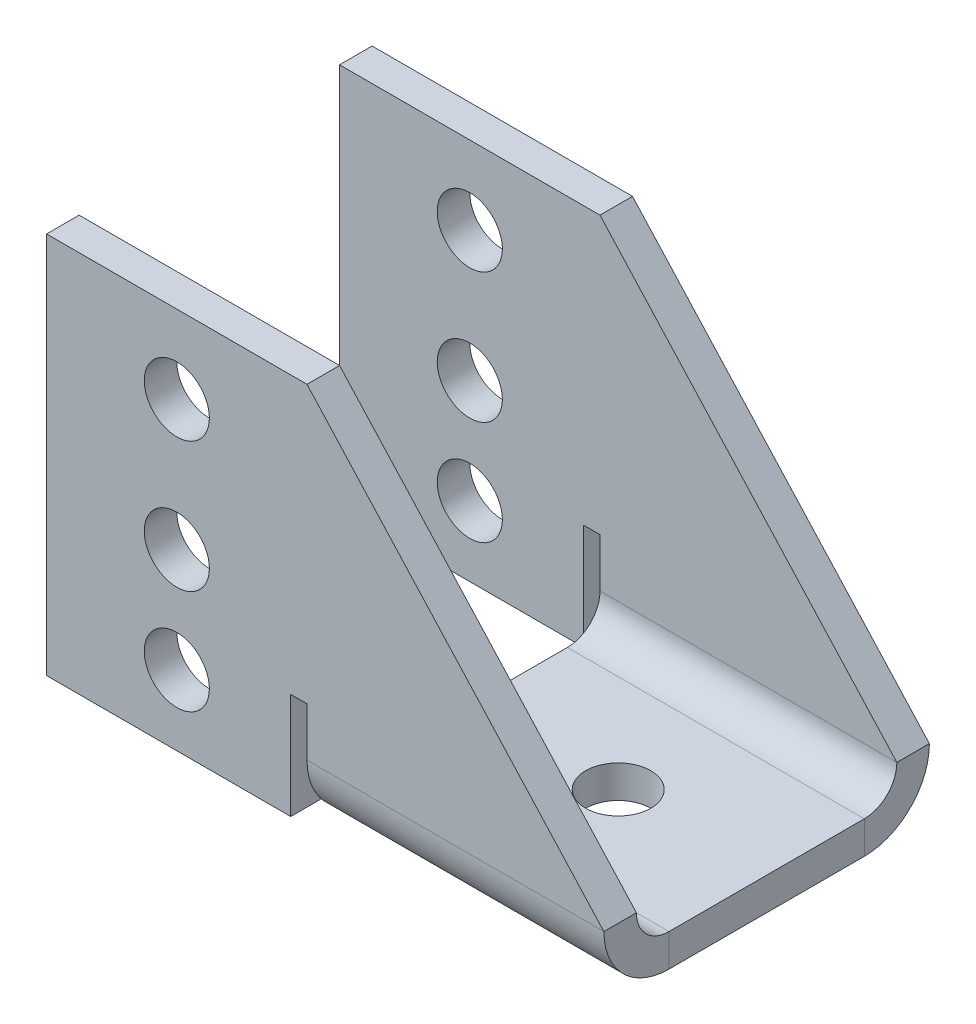
ISO-10303-21;
HEADER;
FILE_DESCRIPTION(('STEP AP214'),'2;1');
FILE_NAME('part.step','',(''),(''),'','','');
FILE_SCHEMA(('AUTOMOTIVE_DESIGN { 1 0 10303 214 1 1 1 1 }'));
ENDSEC;
DATA;
#1=APPLICATION_CONTEXT('core data for automotive mechanical design processes');
#2=APPLICATION_PROTOCOL_DEFINITION('international standard','automotive_design',2000,#1);
#3=PRODUCT_CONTEXT('',#1,'mechanical');
#4=PRODUCT('Part','Part','',(#3));
#5=PRODUCT_RELATED_PRODUCT_CATEGORY('part','',(#4));
#6=PRODUCT_DEFINITION_FORMATION('','',#4);
#7=PRODUCT_DEFINITION_CONTEXT('part definition',#1,'design');
#8=PRODUCT_DEFINITION('design','',#6,#7);
#9=PRODUCT_DEFINITION_SHAPE('','',#8);
#10=(LENGTH_UNIT() NAMED_UNIT(*) SI_UNIT(.MILLI.,.METRE.));
#11=(NAMED_UNIT(*) PLANE_ANGLE_UNIT() SI_UNIT($,.RADIAN.));
#12=(NAMED_UNIT(*) SI_UNIT($,.STERADIAN.) SOLID_ANGLE_UNIT());
#13=UNCERTAINTY_MEASURE_WITH_UNIT(LENGTH_MEASURE(1.E-05),#10,'distance_accuracy_value','');
#14=(GEOMETRIC_REPRESENTATION_CONTEXT(3) GLOBAL_UNCERTAINTY_ASSIGNED_CONTEXT((#13)) GLOBAL_UNIT_ASSIGNED_CONTEXT((#10,
#11,#12)) REPRESENTATION_CONTEXT('',''));
#15=CARTESIAN_POINT('',(0.,0.,0.));
#16=DIRECTION('',(0.,0.,1.));
#17=DIRECTION('',(1.,0.,0.));
#18=AXIS2_PLACEMENT_3D('',#15,#16,#17);
#19=CARTESIAN_POINT('',(54.356,3.175,-25.4));
#20=DIRECTION('',(1.,0.,0.));
#21=DIRECTION('',(0.,0.,1.));
#22=AXIS2_PLACEMENT_3D('',#19,#20,#21);
#23=PLANE('',#22);
#24=DIRECTION('',(0.,1.,0.));
#25=VECTOR('',#24,1.);
#26=CARTESIAN_POINT('',(54.356,3.175,-3.175));
#27=LINE('',#26,#25);
#28=CARTESIAN_POINT('',(54.356,0.,-3.175));
#29=VERTEX_POINT('',#28);
#30=CARTESIAN_POINT('',(54.356,3.175,-3.175));
#31=VERTEX_POINT('',#30);
#32=EDGE_CURVE('E11',#29,#31,#27,.T.);
#33=ORIENTED_EDGE('',*,*,#32,.F.);
#34=DIRECTION('',(0.,0.,1.));
#35=VECTOR('',#34,1.);
#36=CARTESIAN_POINT('',(54.356,0.,-25.4));
#37=LINE('',#36,#35);
#38=CARTESIAN_POINT('',(54.356,0.,-22.225));
#39=VERTEX_POINT('',#38);
#40=EDGE_CURVE('E124',#39,#29,#37,.T.);
#41=ORIENTED_EDGE('',*,*,#40,.F.);
#42=DIRECTION('',(0.,1.,0.));
#43=VECTOR('',#42,1.);
#44=CARTESIAN_POINT('',(54.356,3.175,-22.225));
#45=LINE('',#44,#43);
#46=CARTESIAN_POINT('',(54.356,3.175,-22.225));
#47=VERTEX_POINT('',#46);
#48=EDGE_CURVE('E53',#39,#47,#45,.T.);
#49=ORIENTED_EDGE('',*,*,#48,.T.);
#50=DIRECTION('',(0.,0.,1.));
#51=VECTOR('',#50,1.);
#52=CARTESIAN_POINT('',(54.356,3.175,-25.4));
#53=LINE('',#52,#51);
#54=EDGE_CURVE('E126',#47,#31,#53,.T.);
#55=ORIENTED_EDGE('',*,*,#54,.T.);
#56=EDGE_LOOP('',(#33,#41,#49,#55));
#57=FACE_BOUND('',#56,.T.);
#58=ADVANCED_FACE('F43',(#57),#23,.T.);
#59=CARTESIAN_POINT('',(54.356,6.35,-22.225));
#60=DIRECTION('',(-1.,0.,0.));
#61=DIRECTION('',(0.,0.,1.));
#62=AXIS2_PLACEMENT_3D('',#59,#60,#61);
#63=PLANE('',#62);
#64=ORIENTED_EDGE('',*,*,#48,.F.);
#65=CARTESIAN_POINT('',(54.356,6.35,-22.225));
#66=DIRECTION('',(-1.,0.,0.));
#67=DIRECTION('',(0.,-1.,0.));
#68=AXIS2_PLACEMENT_3D('',#65,#66,#67);
#69=CIRCLE('',#68,6.35);
#70=CARTESIAN_POINT('',(54.356,6.34999999999999,-28.575));
#71=VERTEX_POINT('',#70);
#72=EDGE_CURVE('E166',#39,#71,#69,.F.);
#73=ORIENTED_EDGE('',*,*,#72,.T.);
#74=DIRECTION('',(0.,0.,1.));
#75=VECTOR('',#74,1.);
#76=CARTESIAN_POINT('',(54.356,6.34999999999999,-25.4));
#77=LINE('',#76,#75);
#78=CARTESIAN_POINT('',(54.356,6.34999999999999,-25.4));
#79=VERTEX_POINT('',#78);
#80=EDGE_CURVE('E239',#71,#79,#77,.T.);
#81=ORIENTED_EDGE('',*,*,#80,.T.);
#82=CARTESIAN_POINT('',(54.356,6.35,-22.225));
#83=DIRECTION('',(1.,0.,0.));
#84=DIRECTION('',(0.,0.,-1.));
#85=AXIS2_PLACEMENT_3D('',#82,#83,#84);
#86=CIRCLE('',#85,3.175);
#87=EDGE_CURVE('E247',#47,#79,#86,.T.);
#88=ORIENTED_EDGE('',*,*,#87,.F.);
#89=EDGE_LOOP('',(#64,#73,#81,#88));
#90=FACE_BOUND('',#89,.T.);
#91=ADVANCED_FACE('F246',(#90),#63,.F.);
#92=CARTESIAN_POINT('',(32.8360294888369,29.9464588938192,-25.4));
#93=DIRECTION('',(0.738869281565121,0.67384878478739,0.));
#94=DIRECTION('',(0.67384878478739,-0.738869281565121,0.));
#95=AXIS2_PLACEMENT_3D('',#92,#93,#94);
#96=PLANE('',#95);
#97=ORIENTED_EDGE('',*,*,#80,.F.);
#98=DIRECTION('',(0.67384878478739,-0.738869281565121,0.));
#99=VECTOR('',#98,1.);
#100=CARTESIAN_POINT('',(32.8360294888369,29.9464588938192,-28.575));
#101=LINE('',#100,#99);
#102=CARTESIAN_POINT('',(25.4,38.1,-28.575));
#103=VERTEX_POINT('',#102);
#104=EDGE_CURVE('E326',#103,#71,#101,.T.);
#105=ORIENTED_EDGE('',*,*,#104,.F.);
#106=DIRECTION('',(0.,0.,1.));
#107=VECTOR('',#106,1.);
#108=CARTESIAN_POINT('',(25.4,38.1,-25.4));
#109=LINE('',#108,#107);
#110=CARTESIAN_POINT('',(25.4,38.1,-25.4));
#111=VERTEX_POINT('',#110);
#112=EDGE_CURVE('E236',#103,#111,#109,.T.);
#113=ORIENTED_EDGE('',*,*,#112,.T.);
#114=DIRECTION('',(0.67384878478739,-0.738869281565121,0.));
#115=VECTOR('',#114,1.);
#116=CARTESIAN_POINT('',(32.8360294888369,29.9464588938192,-25.4));
#117=LINE('',#116,#115);
#118=EDGE_CURVE('E266',#111,#79,#117,.T.);
#119=ORIENTED_EDGE('',*,*,#118,.T.);
#120=EDGE_LOOP('',(#97,#105,#113,#119));
#121=FACE_BOUND('',#120,.T.);
#122=ADVANCED_FACE('F267',(#121),#96,.T.);
#123=CARTESIAN_POINT('',(0.,38.1,-25.4));
#124=DIRECTION('',(0.,1.,0.));
#125=DIRECTION('',(1.,0.,0.));
#126=AXIS2_PLACEMENT_3D('',#123,#124,#125);
#127=PLANE('',#126);
#128=ORIENTED_EDGE('',*,*,#112,.F.);
#129=DIRECTION('',(1.,0.,0.));
#130=VECTOR('',#129,1.);
#131=CARTESIAN_POINT('',(0.,38.1,-28.575));
#132=LINE('',#131,#130);
#133=CARTESIAN_POINT('',(0.,38.1,-28.575));
#134=VERTEX_POINT('',#133);
#135=EDGE_CURVE('E329',#134,#103,#132,.T.);
#136=ORIENTED_EDGE('',*,*,#135,.F.);
#137=DIRECTION('',(0.,0.,1.));
#138=VECTOR('',#137,1.);
#139=CARTESIAN_POINT('',(0.,38.1,-25.4));
#140=LINE('',#139,#138);
#141=CARTESIAN_POINT('',(0.,38.1,-25.4));
#142=VERTEX_POINT('',#141);
#143=EDGE_CURVE('E233',#134,#142,#140,.T.);
#144=ORIENTED_EDGE('',*,*,#143,.T.);
#145=DIRECTION('',(1.,0.,0.));
#146=VECTOR('',#145,1.);
#147=CARTESIAN_POINT('',(0.,38.1,-25.4));
#148=LINE('',#147,#146);
#149=EDGE_CURVE('E271',#142,#111,#148,.T.);
#150=ORIENTED_EDGE('',*,*,#149,.T.);
#151=EDGE_LOOP('',(#128,#136,#144,#150));
#152=FACE_BOUND('',#151,.T.);
#153=ADVANCED_FACE('F341',(#152),#127,.T.);
#154=CARTESIAN_POINT('',(0.,0.,-25.4));
#155=DIRECTION('',(-1.,0.,0.));
#156=DIRECTION('',(0.,1.,0.));
#157=AXIS2_PLACEMENT_3D('',#154,#155,#156);
#158=PLANE('',#157);
#159=ORIENTED_EDGE('',*,*,#143,.F.);
#160=DIRECTION('',(0.,-1.,0.));
#161=VECTOR('',#160,1.);
#162=CARTESIAN_POINT('',(0.,0.,-28.575));
#163=LINE('',#162,#161);
#164=CARTESIAN_POINT('',(0.,0.79375,-28.575));
#165=VERTEX_POINT('',#164);
#166=EDGE_CURVE('E182',#165,#134,#163,.F.);
#167=ORIENTED_EDGE('',*,*,#166,.F.);
#168=DIRECTION('',(0.,0.,1.));
#169=VECTOR('',#168,1.);
#170=CARTESIAN_POINT('',(0.,0.79375,-25.4));
#171=LINE('',#170,#169);
#172=CARTESIAN_POINT('',(0.,0.79375,-25.4));
#173=VERTEX_POINT('',#172);
#174=EDGE_CURVE('E230',#165,#173,#171,.T.);
#175=ORIENTED_EDGE('',*,*,#174,.T.);
#176=DIRECTION('',(0.,1.,0.));
#177=VECTOR('',#176,1.);
#178=CARTESIAN_POINT('',(0.,0.,-25.4));
#179=LINE('',#178,#177);
#180=EDGE_CURVE('E346',#173,#142,#179,.T.);
#181=ORIENTED_EDGE('',*,*,#180,.T.);
#182=EDGE_LOOP('',(#159,#167,#175,#181));
#183=FACE_BOUND('',#182,.T.);
#184=ADVANCED_FACE('F769',(#183),#158,.T.);
#185=CARTESIAN_POINT('',(0.,0.79375,-25.4));
#186=DIRECTION('',(0.,-1.,0.));
#187=DIRECTION('',(-1.,0.,0.));
#188=AXIS2_PLACEMENT_3D('',#185,#186,#187);
#189=PLANE('',#188);
#190=ORIENTED_EDGE('',*,*,#174,.F.);
#191=DIRECTION('',(1.,0.,0.));
#192=VECTOR('',#191,1.);
#193=CARTESIAN_POINT('',(0.,0.79375,-28.575));
#194=LINE('',#193,#192);
#195=CARTESIAN_POINT('',(23.8125,0.79375,-28.575));
#196=VERTEX_POINT('',#195);
#197=EDGE_CURVE('E191',#196,#165,#194,.F.);
#198=ORIENTED_EDGE('',*,*,#197,.F.);
#199=DIRECTION('',(0.,0.,1.));
#200=VECTOR('',#199,1.);
#201=CARTESIAN_POINT('',(23.8125,0.79375,-25.4));
#202=LINE('',#201,#200);
#203=CARTESIAN_POINT('',(23.8125,0.79375,-25.4));
#204=VERTEX_POINT('',#203);
#205=EDGE_CURVE('E227',#196,#204,#202,.T.);
#206=ORIENTED_EDGE('',*,*,#205,.T.);
#207=DIRECTION('',(-1.,0.,0.));
#208=VECTOR('',#207,1.);
#209=CARTESIAN_POINT('',(0.,0.79375,-25.4));
#210=LINE('',#209,#208);
#211=EDGE_CURVE('E272',#204,#173,#210,.T.);
#212=ORIENTED_EDGE('',*,*,#211,.T.);
#213=EDGE_LOOP('',(#190,#198,#206,#212));
#214=FACE_BOUND('',#213,.T.);
#215=ADVANCED_FACE('F416',(#214),#189,.T.);
#216=CARTESIAN_POINT('',(23.8125,0.,-25.4));
#217=DIRECTION('',(-1.,0.,0.));
#218=DIRECTION('',(0.,1.,0.));
#219=AXIS2_PLACEMENT_3D('',#216,#217,#218);
#220=PLANE('',#219);
#221=ORIENTED_EDGE('',*,*,#205,.F.);
#222=DIRECTION('',(0.,-1.,0.));
#223=VECTOR('',#222,1.);
#224=CARTESIAN_POINT('',(23.8125,0.,-28.575));
#225=LINE('',#224,#223);
#226=CARTESIAN_POINT('',(23.8125,11.1125,-28.575));
#227=VERTEX_POINT('',#226);
#228=EDGE_CURVE('E298',#196,#227,#225,.F.);
#229=ORIENTED_EDGE('',*,*,#228,.T.);
#230=DIRECTION('',(0.,0.,1.));
#231=VECTOR('',#230,1.);
#232=CARTESIAN_POINT('',(23.8125,11.1125,-25.4));
#233=LINE('',#232,#231);
#234=CARTESIAN_POINT('',(23.8125,11.1125,-25.4));
#235=VERTEX_POINT('',#234);
#236=EDGE_CURVE('E224',#227,#235,#233,.T.);
#237=ORIENTED_EDGE('',*,*,#236,.T.);
#238=DIRECTION('',(0.,1.,0.));
#239=VECTOR('',#238,1.);
#240=CARTESIAN_POINT('',(23.8125,0.,-25.4));
#241=LINE('',#240,#239);
#242=EDGE_CURVE('E379',#204,#235,#241,.T.);
#243=ORIENTED_EDGE('',*,*,#242,.F.);
#244=EDGE_LOOP('',(#221,#229,#237,#243));
#245=FACE_BOUND('',#244,.T.);
#246=ADVANCED_FACE('F427',(#245),#220,.F.);
#247=CARTESIAN_POINT('',(0.,11.1125,-25.4));
#248=DIRECTION('',(0.,1.,0.));
#249=DIRECTION('',(1.,0.,0.));
#250=AXIS2_PLACEMENT_3D('',#247,#248,#249);
#251=PLANE('',#250);
#252=ORIENTED_EDGE('',*,*,#236,.F.);
#253=DIRECTION('',(1.,0.,0.));
#254=VECTOR('',#253,1.);
#255=CARTESIAN_POINT('',(0.,11.1125,-28.575));
#256=LINE('',#255,#254);
#257=CARTESIAN_POINT('',(25.4,11.1125,-28.575));
#258=VERTEX_POINT('',#257);
#259=EDGE_CURVE('E319',#227,#258,#256,.T.);
#260=ORIENTED_EDGE('',*,*,#259,.T.);
#261=DIRECTION('',(0.,0.,1.));
#262=VECTOR('',#261,1.);
#263=CARTESIAN_POINT('',(25.4,11.1125,-25.4));
#264=LINE('',#263,#262);
#265=CARTESIAN_POINT('',(25.4,11.1125,-25.4));
#266=VERTEX_POINT('',#265);
#267=EDGE_CURVE('E221',#258,#266,#264,.T.);
#268=ORIENTED_EDGE('',*,*,#267,.T.);
#269=DIRECTION('',(1.,0.,0.));
#270=VECTOR('',#269,1.);
#271=CARTESIAN_POINT('',(0.,11.1125,-25.4));
#272=LINE('',#271,#270);
#273=EDGE_CURVE('E382',#235,#266,#272,.T.);
#274=ORIENTED_EDGE('',*,*,#273,.F.);
#275=EDGE_LOOP('',(#252,#260,#268,#274));
#276=FACE_BOUND('',#275,.T.);
#277=ADVANCED_FACE('F433',(#276),#251,.F.);
#278=CARTESIAN_POINT('',(25.4,0.,-25.4));
#279=DIRECTION('',(1.,0.,0.));
#280=DIRECTION('',(0.,-1.,0.));
#281=AXIS2_PLACEMENT_3D('',#278,#279,#280);
#282=PLANE('',#281);
#283=ORIENTED_EDGE('',*,*,#267,.F.);
#284=DIRECTION('',(0.,-1.,0.));
#285=VECTOR('',#284,1.);
#286=CARTESIAN_POINT('',(25.4,0.,-28.575));
#287=LINE('',#286,#285);
#288=CARTESIAN_POINT('',(25.4,6.35,-28.575));
#289=VERTEX_POINT('',#288);
#290=EDGE_CURVE('E313',#258,#289,#287,.T.);
#291=ORIENTED_EDGE('',*,*,#290,.T.);
#292=DIRECTION('',(0.,0.,1.));
#293=VECTOR('',#292,1.);
#294=CARTESIAN_POINT('',(25.4,6.35,-25.4));
#295=LINE('',#294,#293);
#296=CARTESIAN_POINT('',(25.4,6.35,-25.4));
#297=VERTEX_POINT('',#296);
#298=EDGE_CURVE('E218',#289,#297,#295,.T.);
#299=ORIENTED_EDGE('',*,*,#298,.T.);
#300=DIRECTION('',(0.,-1.,0.));
#301=VECTOR('',#300,1.);
#302=CARTESIAN_POINT('',(25.4,0.,-25.4));
#303=LINE('',#302,#301);
#304=EDGE_CURVE('E278',#266,#297,#303,.T.);
#305=ORIENTED_EDGE('',*,*,#304,.F.);
#306=EDGE_LOOP('',(#283,#291,#299,#305));
#307=FACE_BOUND('',#306,.T.);
#308=ADVANCED_FACE('F435',(#307),#282,.F.);
#309=CARTESIAN_POINT('',(25.4,6.35,-22.225));
#310=DIRECTION('',(-1.,0.,0.));
#311=DIRECTION('',(0.,-1.,0.));
#312=AXIS2_PLACEMENT_3D('',#309,#310,#311);
#313=PLANE('',#312);
#314=ORIENTED_EDGE('',*,*,#298,.F.);
#315=CARTESIAN_POINT('',(25.4,6.35,-22.225));
#316=DIRECTION('',(-1.,0.,0.));
#317=DIRECTION('',(0.,-1.,0.));
#318=AXIS2_PLACEMENT_3D('',#315,#316,#317);
#319=CIRCLE('',#318,6.35);
#320=CARTESIAN_POINT('',(25.4,0.,-22.225));
#321=VERTEX_POINT('',#320);
#322=EDGE_CURVE('E161',#289,#321,#319,.T.);
#323=ORIENTED_EDGE('',*,*,#322,.T.);
#324=DIRECTION('',(0.,1.,0.));
#325=VECTOR('',#324,1.);
#326=CARTESIAN_POINT('',(25.4,3.175,-22.225));
#327=LINE('',#326,#325);
#328=CARTESIAN_POINT('',(25.4,3.175,-22.225));
#329=VERTEX_POINT('',#328);
#330=EDGE_CURVE('E216',#321,#329,#327,.T.);
#331=ORIENTED_EDGE('',*,*,#330,.T.);
#332=CARTESIAN_POINT('',(25.4,6.35,-22.225));
#333=DIRECTION('',(1.,0.,0.));
#334=DIRECTION('',(0.,1.,0.));
#335=AXIS2_PLACEMENT_3D('',#332,#333,#334);
#336=CIRCLE('',#335,3.175);
#337=EDGE_CURVE('E263',#297,#329,#336,.F.);
#338=ORIENTED_EDGE('',*,*,#337,.F.);
#339=EDGE_LOOP('',(#314,#323,#331,#338));
#340=FACE_BOUND('',#339,.T.);
#341=ADVANCED_FACE('F811',(#340),#313,.T.);
#342=CARTESIAN_POINT('',(25.4,3.175,-25.4));
#343=DIRECTION('',(1.,0.,0.));
#344=DIRECTION('',(0.,0.,1.));
#345=AXIS2_PLACEMENT_3D('',#342,#343,#344);
#346=PLANE('',#345);
#347=ORIENTED_EDGE('',*,*,#330,.F.);
#348=DIRECTION('',(0.,0.,1.));
#349=VECTOR('',#348,1.);
#350=CARTESIAN_POINT('',(25.4,0.,-25.4));
#351=LINE('',#350,#349);
#352=CARTESIAN_POINT('',(25.4,0.,-3.175));
#353=VERTEX_POINT('',#352);
#354=EDGE_CURVE('E154',#321,#353,#351,.T.);
#355=ORIENTED_EDGE('',*,*,#354,.T.);
#356=DIRECTION('',(0.,1.,0.));
#357=VECTOR('',#356,1.);
#358=CARTESIAN_POINT('',(25.4,3.175,-3.175));
#359=LINE('',#358,#357);
#360=CARTESIAN_POINT('',(25.4,3.175,-3.175));
#361=VERTEX_POINT('',#360);
#362=EDGE_CURVE('E213',#353,#361,#359,.T.);
#363=ORIENTED_EDGE('',*,*,#362,.T.);
#364=DIRECTION('',(0.,0.,1.));
#365=VECTOR('',#364,1.);
#366=CARTESIAN_POINT('',(25.4,3.175,-25.4));
#367=LINE('',#366,#365);
#368=EDGE_CURVE('E355',#329,#361,#367,.T.);
#369=ORIENTED_EDGE('',*,*,#368,.F.);
#370=EDGE_LOOP('',(#347,#355,#363,#369));
#371=FACE_BOUND('',#370,.T.);
#372=ADVANCED_FACE('F821',(#371),#346,.F.);
#373=CARTESIAN_POINT('',(25.4,6.35,-3.175));
#374=DIRECTION('',(-1.,0.,0.));
#375=DIRECTION('',(0.,-1.,0.));
#376=AXIS2_PLACEMENT_3D('',#373,#374,#375);
#377=PLANE('',#376);
#378=ORIENTED_EDGE('',*,*,#362,.F.);
#379=CARTESIAN_POINT('',(25.4,6.35,-3.175));
#380=DIRECTION('',(-1.,0.,0.));
#381=DIRECTION('',(0.,-1.,0.));
#382=AXIS2_PLACEMENT_3D('',#379,#380,#381);
#383=CIRCLE('',#382,6.35);
#384=CARTESIAN_POINT('',(25.4,6.35,3.175));
#385=VERTEX_POINT('',#384);
#386=EDGE_CURVE('E142',#353,#385,#383,.T.);
#387=ORIENTED_EDGE('',*,*,#386,.T.);
#388=DIRECTION('',(0.,0.,-1.));
#389=VECTOR('',#388,1.);
#390=CARTESIAN_POINT('',(25.4,6.35,0.));
#391=LINE('',#390,#389);
#392=CARTESIAN_POINT('',(25.4,6.35,0.));
#393=VERTEX_POINT('',#392);
#394=EDGE_CURVE('E210',#385,#393,#391,.T.);
#395=ORIENTED_EDGE('',*,*,#394,.T.);
#396=CARTESIAN_POINT('',(25.4,6.35,-3.175));
#397=DIRECTION('',(1.,0.,0.));
#398=DIRECTION('',(0.,1.,0.));
#399=AXIS2_PLACEMENT_3D('',#396,#397,#398);
#400=CIRCLE('',#399,3.175);
#401=EDGE_CURVE('E287',#361,#393,#400,.F.);
#402=ORIENTED_EDGE('',*,*,#401,.F.);
#403=EDGE_LOOP('',(#378,#387,#395,#402));
#404=FACE_BOUND('',#403,.T.);
#405=ADVANCED_FACE('F448',(#404),#377,.T.);
#406=CARTESIAN_POINT('',(25.4,0.,0.));
#407=DIRECTION('',(1.,0.,0.));
#408=DIRECTION('',(0.,1.,0.));
#409=AXIS2_PLACEMENT_3D('',#406,#407,#408);
#410=PLANE('',#409);
#411=ORIENTED_EDGE('',*,*,#394,.F.);
#412=DIRECTION('',(0.,1.,0.));
#413=VECTOR('',#412,1.);
#414=CARTESIAN_POINT('',(25.4,0.,3.175));
#415=LINE('',#414,#413);
#416=CARTESIAN_POINT('',(25.4,11.1125,3.175));
#417=VERTEX_POINT('',#416);
#418=EDGE_CURVE('E147',#385,#417,#415,.T.);
#419=ORIENTED_EDGE('',*,*,#418,.T.);
#420=DIRECTION('',(0.,0.,-1.));
#421=VECTOR('',#420,1.);
#422=CARTESIAN_POINT('',(25.4,11.1125,0.));
#423=LINE('',#422,#421);
#424=CARTESIAN_POINT('',(25.4,11.1125,0.));
#425=VERTEX_POINT('',#424);
#426=EDGE_CURVE('E207',#417,#425,#423,.T.);
#427=ORIENTED_EDGE('',*,*,#426,.T.);
#428=DIRECTION('',(0.,1.,0.));
#429=VECTOR('',#428,1.);
#430=CARTESIAN_POINT('',(25.4,0.,0.));
#431=LINE('',#430,#429);
#432=EDGE_CURVE('E391',#393,#425,#431,.T.);
#433=ORIENTED_EDGE('',*,*,#432,.F.);
#434=EDGE_LOOP('',(#411,#419,#427,#433));
#435=FACE_BOUND('',#434,.T.);
#436=ADVANCED_FACE('F451',(#435),#410,.F.);
#437=CARTESIAN_POINT('',(0.,11.1125,0.));
#438=DIRECTION('',(0.,1.,0.));
#439=DIRECTION('',(-1.,0.,0.));
#440=AXIS2_PLACEMENT_3D('',#437,#438,#439);
#441=PLANE('',#440);
#442=ORIENTED_EDGE('',*,*,#426,.F.);
#443=DIRECTION('',(1.,0.,0.));
#444=VECTOR('',#443,1.);
#445=CARTESIAN_POINT('',(0.,11.1125,3.175));
#446=LINE('',#445,#444);
#447=CARTESIAN_POINT('',(23.8125,11.1125,3.175));
#448=VERTEX_POINT('',#447);
#449=EDGE_CURVE('E310',#417,#448,#446,.F.);
#450=ORIENTED_EDGE('',*,*,#449,.T.);
#451=DIRECTION('',(0.,0.,-1.));
#452=VECTOR('',#451,1.);
#453=CARTESIAN_POINT('',(23.8125,11.1125,0.));
#454=LINE('',#453,#452);
#455=CARTESIAN_POINT('',(23.8125,11.1125,0.));
#456=VERTEX_POINT('',#455);
#457=EDGE_CURVE('E204',#448,#456,#454,.T.);
#458=ORIENTED_EDGE('',*,*,#457,.T.);
#459=DIRECTION('',(-1.,0.,0.));
#460=VECTOR('',#459,1.);
#461=CARTESIAN_POINT('',(0.,11.1125,0.));
#462=LINE('',#461,#460);
#463=EDGE_CURVE('E385',#425,#456,#462,.T.);
#464=ORIENTED_EDGE('',*,*,#463,.F.);
#465=EDGE_LOOP('',(#442,#450,#458,#464));
#466=FACE_BOUND('',#465,.T.);
#467=ADVANCED_FACE('F460',(#466),#441,.F.);
#468=CARTESIAN_POINT('',(23.8125,0.,0.));
#469=DIRECTION('',(-1.,0.,0.));
#470=DIRECTION('',(0.,-1.,0.));
#471=AXIS2_PLACEMENT_3D('',#468,#469,#470);
#472=PLANE('',#471);
#473=ORIENTED_EDGE('',*,*,#457,.F.);
#474=DIRECTION('',(0.,1.,0.));
#475=VECTOR('',#474,1.);
#476=CARTESIAN_POINT('',(23.8125,0.,3.175));
#477=LINE('',#476,#475);
#478=CARTESIAN_POINT('',(23.8125,0.79375,3.175));
#479=VERTEX_POINT('',#478);
#480=EDGE_CURVE('E307',#448,#479,#477,.F.);
#481=ORIENTED_EDGE('',*,*,#480,.T.);
#482=DIRECTION('',(0.,0.,-1.));
#483=VECTOR('',#482,1.);
#484=CARTESIAN_POINT('',(23.8125,0.79375,0.));
#485=LINE('',#484,#483);
#486=CARTESIAN_POINT('',(23.8125,0.79375,0.));
#487=VERTEX_POINT('',#486);
#488=EDGE_CURVE('E201',#479,#487,#485,.T.);
#489=ORIENTED_EDGE('',*,*,#488,.T.);
#490=DIRECTION('',(0.,-1.,0.));
#491=VECTOR('',#490,1.);
#492=CARTESIAN_POINT('',(23.8125,0.,0.));
#493=LINE('',#492,#491);
#494=EDGE_CURVE('E388',#456,#487,#493,.T.);
#495=ORIENTED_EDGE('',*,*,#494,.F.);
#496=EDGE_LOOP('',(#473,#481,#489,#495));
#497=FACE_BOUND('',#496,.T.);
#498=ADVANCED_FACE('F488',(#497),#472,.F.);
#499=CARTESIAN_POINT('',(0.,0.79375,0.));
#500=DIRECTION('',(0.,-1.,0.));
#501=DIRECTION('',(1.,0.,0.));
#502=AXIS2_PLACEMENT_3D('',#499,#500,#501);
#503=PLANE('',#502);
#504=ORIENTED_EDGE('',*,*,#488,.F.);
#505=DIRECTION('',(1.,0.,0.));
#506=VECTOR('',#505,1.);
#507=CARTESIAN_POINT('',(0.,0.79375,3.175));
#508=LINE('',#507,#506);
#509=CARTESIAN_POINT('',(0.,0.79375,3.175));
#510=VERTEX_POINT('',#509);
#511=EDGE_CURVE('E179',#510,#479,#508,.T.);
#512=ORIENTED_EDGE('',*,*,#511,.F.);
#513=DIRECTION('',(0.,0.,-1.));
#514=VECTOR('',#513,1.);
#515=CARTESIAN_POINT('',(0.,0.79375,0.));
#516=LINE('',#515,#514);
#517=CARTESIAN_POINT('',(0.,0.79375,0.));
#518=VERTEX_POINT('',#517);
#519=EDGE_CURVE('E198',#510,#518,#516,.T.);
#520=ORIENTED_EDGE('',*,*,#519,.T.);
#521=DIRECTION('',(1.,0.,0.));
#522=VECTOR('',#521,1.);
#523=CARTESIAN_POINT('',(0.,0.79375,0.));
#524=LINE('',#523,#522);
#525=EDGE_CURVE('E367',#518,#487,#524,.T.);
#526=ORIENTED_EDGE('',*,*,#525,.T.);
#527=EDGE_LOOP('',(#504,#512,#520,#526));
#528=FACE_BOUND('',#527,.T.);
#529=ADVANCED_FACE('F479',(#528),#503,.T.);
#530=CARTESIAN_POINT('',(0.,0.,0.));
#531=DIRECTION('',(1.,0.,0.));
#532=DIRECTION('',(0.,1.,0.));
#533=AXIS2_PLACEMENT_3D('',#530,#531,#532);
#534=PLANE('',#533);
#535=ORIENTED_EDGE('',*,*,#519,.F.);
#536=DIRECTION('',(0.,1.,0.));
#537=VECTOR('',#536,1.);
#538=CARTESIAN_POINT('',(0.,0.,3.175));
#539=LINE('',#538,#537);
#540=CARTESIAN_POINT('',(0.,38.1,3.175));
#541=VERTEX_POINT('',#540);
#542=EDGE_CURVE('E302',#510,#541,#539,.T.);
#543=ORIENTED_EDGE('',*,*,#542,.T.);
#544=DIRECTION('',(0.,0.,-1.));
#545=VECTOR('',#544,1.);
#546=CARTESIAN_POINT('',(0.,38.1,0.));
#547=LINE('',#546,#545);
#548=CARTESIAN_POINT('',(0.,38.1,0.));
#549=VERTEX_POINT('',#548);
#550=EDGE_CURVE('E195',#541,#549,#547,.T.);
#551=ORIENTED_EDGE('',*,*,#550,.T.);
#552=DIRECTION('',(0.,1.,0.));
#553=VECTOR('',#552,1.);
#554=CARTESIAN_POINT('',(0.,0.,0.));
#555=LINE('',#554,#553);
#556=EDGE_CURVE('E370',#518,#549,#555,.T.);
#557=ORIENTED_EDGE('',*,*,#556,.F.);
#558=EDGE_LOOP('',(#535,#543,#551,#557));
#559=FACE_BOUND('',#558,.T.);
#560=ADVANCED_FACE('F484',(#559),#534,.F.);
#561=CARTESIAN_POINT('',(0.,38.1,0.));
#562=DIRECTION('',(0.,-1.,0.));
#563=DIRECTION('',(1.,0.,0.));
#564=AXIS2_PLACEMENT_3D('',#561,#562,#563);
#565=PLANE('',#564);
#566=ORIENTED_EDGE('',*,*,#550,.F.);
#567=DIRECTION('',(1.,0.,0.));
#568=VECTOR('',#567,1.);
#569=CARTESIAN_POINT('',(0.,38.1,3.175));
#570=LINE('',#569,#568);
#571=CARTESIAN_POINT('',(25.4,38.1,3.175));
#572=VERTEX_POINT('',#571);
#573=EDGE_CURVE('E299',#541,#572,#570,.T.);
#574=ORIENTED_EDGE('',*,*,#573,.T.);
#575=DIRECTION('',(0.,0.,-1.));
#576=VECTOR('',#575,1.);
#577=CARTESIAN_POINT('',(25.4,38.1,0.));
#578=LINE('',#577,#576);
#579=CARTESIAN_POINT('',(25.4,38.1,0.));
#580=VERTEX_POINT('',#579);
#581=EDGE_CURVE('E192',#572,#580,#578,.T.);
#582=ORIENTED_EDGE('',*,*,#581,.T.);
#583=DIRECTION('',(1.,0.,0.));
#584=VECTOR('',#583,1.);
#585=CARTESIAN_POINT('',(0.,38.1,0.));
#586=LINE('',#585,#584);
#587=EDGE_CURVE('E373',#549,#580,#586,.T.);
#588=ORIENTED_EDGE('',*,*,#587,.F.);
#589=EDGE_LOOP('',(#566,#574,#582,#588));
#590=FACE_BOUND('',#589,.T.);
#591=ADVANCED_FACE('F486',(#590),#565,.F.);
#592=CARTESIAN_POINT('',(32.8360294888369,29.9464588938192,0.));
#593=DIRECTION('',(-0.738869281565121,-0.67384878478739,0.));
#594=DIRECTION('',(0.67384878478739,-0.738869281565121,0.));
#595=AXIS2_PLACEMENT_3D('',#592,#593,#594);
#596=PLANE('',#595);
#597=ORIENTED_EDGE('',*,*,#581,.F.);
#598=DIRECTION('',(0.67384878478739,-0.738869281565121,0.));
#599=VECTOR('',#598,1.);
#600=CARTESIAN_POINT('',(32.8360294888369,29.9464588938192,3.175));
#601=LINE('',#600,#599);
#602=CARTESIAN_POINT('',(54.356,6.34999999999999,3.175));
#603=VERTEX_POINT('',#602);
#604=EDGE_CURVE('E296',#572,#603,#601,.T.);
#605=ORIENTED_EDGE('',*,*,#604,.T.);
#606=DIRECTION('',(0.,0.,-1.));
#607=VECTOR('',#606,1.);
#608=CARTESIAN_POINT('',(54.356,6.34999999999999,0.));
#609=LINE('',#608,#607);
#610=CARTESIAN_POINT('',(54.356,6.34999999999999,0.));
#611=VERTEX_POINT('',#610);
#612=EDGE_CURVE('E47',#603,#611,#609,.T.);
#613=ORIENTED_EDGE('',*,*,#612,.T.);
#614=DIRECTION('',(0.67384878478739,-0.738869281565121,0.));
#615=VECTOR('',#614,1.);
#616=CARTESIAN_POINT('',(32.8360294888369,29.9464588938192,0.));
#617=LINE('',#616,#615);
#618=EDGE_CURVE('E376',#580,#611,#617,.T.);
#619=ORIENTED_EDGE('',*,*,#618,.F.);
#620=EDGE_LOOP('',(#597,#605,#613,#619));
#621=FACE_BOUND('',#620,.T.);
#622=ADVANCED_FACE('F526',(#621),#596,.F.);
#623=CARTESIAN_POINT('',(12.7,30.48,-25.4));
#624=DIRECTION('',(0.,0.,-1.));
#625=DIRECTION('',(-1.,0.,0.));
#626=AXIS2_PLACEMENT_3D('',#623,#624,#625);
#627=CYLINDRICAL_SURFACE('',#626,3.175);
#628=CARTESIAN_POINT('',(12.7,30.48,-25.4));
#629=DIRECTION('',(0.,0.,-1.));
#630=DIRECTION('',(-1.,0.,0.));
#631=AXIS2_PLACEMENT_3D('',#628,#629,#630);
#632=CIRCLE('',#631,3.175);
#633=CARTESIAN_POINT('',(9.525,30.48,-25.4));
#634=VERTEX_POINT('',#633);
#635=EDGE_CURVE('E398',#634,#634,#632,.T.);
#636=ORIENTED_EDGE('',*,*,#635,.F.);
#637=EDGE_LOOP('',(#636));
#638=FACE_BOUND('',#637,.T.);
#639=CARTESIAN_POINT('',(12.7,30.48,-28.575));
#640=DIRECTION('',(0.,0.,-1.));
#641=DIRECTION('',(-1.,0.,0.));
#642=AXIS2_PLACEMENT_3D('',#639,#640,#641);
#643=CIRCLE('',#642,3.175);
#644=CARTESIAN_POINT('',(9.525,30.48,-28.575));
#645=VERTEX_POINT('',#644);
#646=EDGE_CURVE('E163',#645,#645,#643,.T.);
#647=ORIENTED_EDGE('',*,*,#646,.T.);
#648=EDGE_LOOP('',(#647));
#649=FACE_BOUND('',#648,.T.);
#650=ADVANCED_FACE('F523',(#638,#649),#627,.F.);
#651=CARTESIAN_POINT('',(12.7,17.78,-25.4));
#652=DIRECTION('',(0.,0.,-1.));
#653=DIRECTION('',(-1.,0.,0.));
#654=AXIS2_PLACEMENT_3D('',#651,#652,#653);
#655=CYLINDRICAL_SURFACE('',#654,3.17500000000001);
#656=CARTESIAN_POINT('',(12.7,17.78,-25.4));
#657=DIRECTION('',(0.,0.,-1.));
#658=DIRECTION('',(-1.,0.,0.));
#659=AXIS2_PLACEMENT_3D('',#656,#657,#658);
#660=CIRCLE('',#659,3.17500000000001);
#661=CARTESIAN_POINT('',(9.52499999999999,17.78,-25.4));
#662=VERTEX_POINT('',#661);
#663=EDGE_CURVE('E403',#662,#662,#660,.T.);
#664=ORIENTED_EDGE('',*,*,#663,.F.);
#665=EDGE_LOOP('',(#664));
#666=FACE_BOUND('',#665,.T.);
#667=CARTESIAN_POINT('',(12.7,17.78,-28.575));
#668=DIRECTION('',(0.,0.,-1.));
#669=DIRECTION('',(-1.,0.,0.));
#670=AXIS2_PLACEMENT_3D('',#667,#668,#669);
#671=CIRCLE('',#670,3.17500000000001);
#672=CARTESIAN_POINT('',(9.52499999999999,17.78,-28.575));
#673=VERTEX_POINT('',#672);
#674=EDGE_CURVE('E185',#673,#673,#671,.T.);
#675=ORIENTED_EDGE('',*,*,#674,.T.);
#676=EDGE_LOOP('',(#675));
#677=FACE_BOUND('',#676,.T.);
#678=ADVANCED_FACE('F525',(#666,#677),#655,.F.);
#679=CARTESIAN_POINT('',(12.7,7.62,-25.4));
#680=DIRECTION('',(0.,0.,-1.));
#681=DIRECTION('',(-1.,0.,0.));
#682=AXIS2_PLACEMENT_3D('',#679,#680,#681);
#683=CYLINDRICAL_SURFACE('',#682,3.175);
#684=CARTESIAN_POINT('',(12.7,7.62,-25.4));
#685=DIRECTION('',(0.,0.,-1.));
#686=DIRECTION('',(-1.,0.,0.));
#687=AXIS2_PLACEMENT_3D('',#684,#685,#686);
#688=CIRCLE('',#687,3.175);
#689=CARTESIAN_POINT('',(9.525,7.62,-25.4));
#690=VERTEX_POINT('',#689);
#691=EDGE_CURVE('E408',#690,#690,#688,.T.);
#692=ORIENTED_EDGE('',*,*,#691,.F.);
#693=EDGE_LOOP('',(#692));
#694=FACE_BOUND('',#693,.T.);
#695=CARTESIAN_POINT('',(12.7,7.62,-28.575));
#696=DIRECTION('',(0.,0.,-1.));
#697=DIRECTION('',(-1.,0.,0.));
#698=AXIS2_PLACEMENT_3D('',#695,#696,#697);
#699=CIRCLE('',#698,3.175);
#700=CARTESIAN_POINT('',(9.525,7.62,-28.575));
#701=VERTEX_POINT('',#700);
#702=EDGE_CURVE('E188',#701,#701,#699,.T.);
#703=ORIENTED_EDGE('',*,*,#702,.T.);
#704=EDGE_LOOP('',(#703));
#705=FACE_BOUND('',#704,.T.);
#706=ADVANCED_FACE('F45',(#694,#705),#683,.F.);
#707=CARTESIAN_POINT('',(39.878,3.175,-12.7));
#708=DIRECTION('',(0.,-1.,0.));
#709=DIRECTION('',(1.,0.,0.));
#710=AXIS2_PLACEMENT_3D('',#707,#708,#709);
#711=CYLINDRICAL_SURFACE('',#710,3.175);
#712=CARTESIAN_POINT('',(39.878,3.175,-12.7));
#713=DIRECTION('',(0.,-1.,0.));
#714=DIRECTION('',(1.,0.,0.));
#715=AXIS2_PLACEMENT_3D('',#712,#713,#714);
#716=CIRCLE('',#715,3.175);
#717=CARTESIAN_POINT('',(43.053,3.175,-12.7));
#718=VERTEX_POINT('',#717);
#719=EDGE_CURVE('E348',#718,#718,#716,.T.);
#720=ORIENTED_EDGE('',*,*,#719,.F.);
#721=EDGE_LOOP('',(#720));
#722=FACE_BOUND('',#721,.T.);
#723=CARTESIAN_POINT('',(39.878,0.,-12.7));
#724=DIRECTION('',(0.,-1.,0.));
#725=DIRECTION('',(1.,0.,0.));
#726=AXIS2_PLACEMENT_3D('',#723,#724,#725);
#727=CIRCLE('',#726,3.175);
#728=CARTESIAN_POINT('',(43.053,0.,-12.7));
#729=VERTEX_POINT('',#728);
#730=EDGE_CURVE('E155',#729,#729,#727,.T.);
#731=ORIENTED_EDGE('',*,*,#730,.T.);
#732=EDGE_LOOP('',(#731));
#733=FACE_BOUND('',#732,.T.);
#734=ADVANCED_FACE('F512',(#722,#733),#711,.F.);
#735=CARTESIAN_POINT('',(12.7,30.48,0.));
#736=DIRECTION('',(0.,0.,1.));
#737=DIRECTION('',(1.,0.,0.));
#738=AXIS2_PLACEMENT_3D('',#735,#736,#737);
#739=CYLINDRICAL_SURFACE('',#738,3.175);
#740=CARTESIAN_POINT('',(12.7,30.48,0.));
#741=DIRECTION('',(0.,0.,1.));
#742=DIRECTION('',(1.,0.,0.));
#743=AXIS2_PLACEMENT_3D('',#740,#741,#742);
#744=CIRCLE('',#743,3.175);
#745=CARTESIAN_POINT('',(15.875,30.48,0.));
#746=VERTEX_POINT('',#745);
#747=EDGE_CURVE('E358',#746,#746,#744,.T.);
#748=ORIENTED_EDGE('',*,*,#747,.F.);
#749=EDGE_LOOP('',(#748));
#750=FACE_BOUND('',#749,.T.);
#751=CARTESIAN_POINT('',(12.7,30.48,3.175));
#752=DIRECTION('',(0.,0.,1.));
#753=DIRECTION('',(1.,0.,0.));
#754=AXIS2_PLACEMENT_3D('',#751,#752,#753);
#755=CIRCLE('',#754,3.175);
#756=CARTESIAN_POINT('',(15.875,30.48,3.175));
#757=VERTEX_POINT('',#756);
#758=EDGE_CURVE('E170',#757,#757,#755,.T.);
#759=ORIENTED_EDGE('',*,*,#758,.T.);
#760=EDGE_LOOP('',(#759));
#761=FACE_BOUND('',#760,.T.);
#762=ADVANCED_FACE('F508',(#750,#761),#739,.F.);
#763=CARTESIAN_POINT('',(12.7,17.78,0.));
#764=DIRECTION('',(0.,0.,1.));
#765=DIRECTION('',(1.,0.,0.));
#766=AXIS2_PLACEMENT_3D('',#763,#764,#765);
#767=CYLINDRICAL_SURFACE('',#766,3.17500000000001);
#768=CARTESIAN_POINT('',(12.7,17.78,0.));
#769=DIRECTION('',(0.,0.,1.));
#770=DIRECTION('',(1.,0.,0.));
#771=AXIS2_PLACEMENT_3D('',#768,#769,#770);
#772=CIRCLE('',#771,3.17500000000001);
#773=CARTESIAN_POINT('',(15.875,17.78,0.));
#774=VERTEX_POINT('',#773);
#775=EDGE_CURVE('E361',#774,#774,#772,.T.);
#776=ORIENTED_EDGE('',*,*,#775,.F.);
#777=EDGE_LOOP('',(#776));
#778=FACE_BOUND('',#777,.T.);
#779=CARTESIAN_POINT('',(12.7,17.78,3.175));
#780=DIRECTION('',(0.,0.,1.));
#781=DIRECTION('',(1.,0.,0.));
#782=AXIS2_PLACEMENT_3D('',#779,#780,#781);
#783=CIRCLE('',#782,3.17500000000001);
#784=CARTESIAN_POINT('',(15.875,17.78,3.175));
#785=VERTEX_POINT('',#784);
#786=EDGE_CURVE('E173',#785,#785,#783,.T.);
#787=ORIENTED_EDGE('',*,*,#786,.T.);
#788=EDGE_LOOP('',(#787));
#789=FACE_BOUND('',#788,.T.);
#790=ADVANCED_FACE('F511',(#778,#789),#767,.F.);
#791=CARTESIAN_POINT('',(12.7,7.62,0.));
#792=DIRECTION('',(0.,0.,1.));
#793=DIRECTION('',(1.,0.,0.));
#794=AXIS2_PLACEMENT_3D('',#791,#792,#793);
#795=CYLINDRICAL_SURFACE('',#794,3.175);
#796=CARTESIAN_POINT('',(12.7,7.62,0.));
#797=DIRECTION('',(0.,0.,1.));
#798=DIRECTION('',(1.,0.,0.));
#799=AXIS2_PLACEMENT_3D('',#796,#797,#798);
#800=CIRCLE('',#799,3.175);
#801=CARTESIAN_POINT('',(15.875,7.62,0.));
#802=VERTEX_POINT('',#801);
#803=EDGE_CURVE('E364',#802,#802,#800,.T.);
#804=ORIENTED_EDGE('',*,*,#803,.F.);
#805=EDGE_LOOP('',(#804));
#806=FACE_BOUND('',#805,.T.);
#807=CARTESIAN_POINT('',(12.7,7.62,3.175));
#808=DIRECTION('',(0.,0.,1.));
#809=DIRECTION('',(1.,0.,0.));
#810=AXIS2_PLACEMENT_3D('',#807,#808,#809);
#811=CIRCLE('',#810,3.175);
#812=CARTESIAN_POINT('',(15.875,7.62,3.175));
#813=VERTEX_POINT('',#812);
#814=EDGE_CURVE('E176',#813,#813,#811,.T.);
#815=ORIENTED_EDGE('',*,*,#814,.T.);
#816=EDGE_LOOP('',(#815));
#817=FACE_BOUND('',#816,.T.);
#818=ADVANCED_FACE('F507',(#806,#817),#795,.F.);
#819=CARTESIAN_POINT('',(54.356,6.35,-3.175));
#820=DIRECTION('',(1.,0.,0.));
#821=DIRECTION('',(0.,0.,-1.));
#822=AXIS2_PLACEMENT_3D('',#819,#820,#821);
#823=PLANE('',#822);
#824=CARTESIAN_POINT('',(54.356,6.35,-3.175));
#825=DIRECTION('',(-1.,0.,0.));
#826=DIRECTION('',(0.,-1.,0.));
#827=AXIS2_PLACEMENT_3D('',#824,#825,#826);
#828=CIRCLE('',#827,6.35);
#829=EDGE_CURVE('E139',#603,#29,#828,.F.);
#830=ORIENTED_EDGE('',*,*,#829,.T.);
#831=ORIENTED_EDGE('',*,*,#32,.T.);
#832=CARTESIAN_POINT('',(54.356,6.35,-3.175));
#833=DIRECTION('',(-1.,0.,0.));
#834=DIRECTION('',(0.,0.,1.));
#835=AXIS2_PLACEMENT_3D('',#832,#833,#834);
#836=CIRCLE('',#835,3.175);
#837=EDGE_CURVE('E291',#611,#31,#836,.F.);
#838=ORIENTED_EDGE('',*,*,#837,.F.);
#839=ORIENTED_EDGE('',*,*,#612,.F.);
#840=EDGE_LOOP('',(#830,#831,#838,#839));
#841=FACE_BOUND('',#840,.T.);
#842=ADVANCED_FACE('F158',(#841),#823,.T.);
#843=CARTESIAN_POINT('',(0.,0.,0.));
#844=DIRECTION('',(0.,0.,1.));
#845=DIRECTION('',(1.,0.,0.));
#846=AXIS2_PLACEMENT_3D('',#843,#844,#845);
#847=PLANE('',#846);
#848=ORIENTED_EDGE('',*,*,#618,.T.);
#849=DIRECTION('',(1.,0.,0.));
#850=VECTOR('',#849,1.);
#851=CARTESIAN_POINT('',(25.4,6.35,0.));
#852=LINE('',#851,#850);
#853=EDGE_CURVE('E280',#611,#393,#852,.F.);
#854=ORIENTED_EDGE('',*,*,#853,.T.);
#855=ORIENTED_EDGE('',*,*,#432,.T.);
#856=ORIENTED_EDGE('',*,*,#463,.T.);
#857=ORIENTED_EDGE('',*,*,#494,.T.);
#858=ORIENTED_EDGE('',*,*,#525,.F.);
#859=ORIENTED_EDGE('',*,*,#556,.T.);
#860=ORIENTED_EDGE('',*,*,#587,.T.);
#861=EDGE_LOOP('',(#848,#854,#855,#856,#857,#858,#859,#860));
#862=FACE_BOUND('',#861,.T.);
#863=ORIENTED_EDGE('',*,*,#747,.T.);
#864=EDGE_LOOP('',(#863));
#865=FACE_BOUND('',#864,.T.);
#866=ORIENTED_EDGE('',*,*,#775,.T.);
#867=EDGE_LOOP('',(#866));
#868=FACE_BOUND('',#867,.T.);
#869=ORIENTED_EDGE('',*,*,#803,.T.);
#870=EDGE_LOOP('',(#869));
#871=FACE_BOUND('',#870,.T.);
#872=ADVANCED_FACE('F464',(#862,#865,#868,#871),#847,.F.);
#873=CARTESIAN_POINT('',(54.356,3.175,-25.4));
#874=DIRECTION('',(0.,-1.,0.));
#875=DIRECTION('',(1.,0.,0.));
#876=AXIS2_PLACEMENT_3D('',#873,#874,#875);
#877=PLANE('',#876);
#878=ORIENTED_EDGE('',*,*,#719,.T.);
#879=EDGE_LOOP('',(#878));
#880=FACE_BOUND('',#879,.T.);
#881=ORIENTED_EDGE('',*,*,#54,.F.);
#882=DIRECTION('',(1.,0.,0.));
#883=VECTOR('',#882,1.);
#884=CARTESIAN_POINT('',(25.4,3.175,-22.225));
#885=LINE('',#884,#883);
#886=EDGE_CURVE('E262',#47,#329,#885,.F.);
#887=ORIENTED_EDGE('',*,*,#886,.T.);
#888=ORIENTED_EDGE('',*,*,#368,.T.);
#889=DIRECTION('',(1.,0.,0.));
#890=VECTOR('',#889,1.);
#891=CARTESIAN_POINT('',(54.356,3.175,-3.175));
#892=LINE('',#891,#890);
#893=EDGE_CURVE('E284',#361,#31,#892,.T.);
#894=ORIENTED_EDGE('',*,*,#893,.T.);
#895=EDGE_LOOP('',(#881,#887,#888,#894));
#896=FACE_BOUND('',#895,.T.);
#897=ADVANCED_FACE('F636',(#880,#896),#877,.F.);
#898=CARTESIAN_POINT('',(0.,0.,-25.4));
#899=DIRECTION('',(0.,0.,-1.));
#900=DIRECTION('',(1.,0.,0.));
#901=AXIS2_PLACEMENT_3D('',#898,#899,#900);
#902=PLANE('',#901);
#903=ORIENTED_EDGE('',*,*,#635,.T.);
#904=EDGE_LOOP('',(#903));
#905=FACE_BOUND('',#904,.T.);
#906=ORIENTED_EDGE('',*,*,#663,.T.);
#907=EDGE_LOOP('',(#906));
#908=FACE_BOUND('',#907,.T.);
#909=ORIENTED_EDGE('',*,*,#691,.T.);
#910=EDGE_LOOP('',(#909));
#911=FACE_BOUND('',#910,.T.);
#912=ORIENTED_EDGE('',*,*,#304,.T.);
#913=DIRECTION('',(1.,0.,0.));
#914=VECTOR('',#913,1.);
#915=CARTESIAN_POINT('',(54.356,6.35,-25.4));
#916=LINE('',#915,#914);
#917=EDGE_CURVE('E260',#297,#79,#916,.T.);
#918=ORIENTED_EDGE('',*,*,#917,.T.);
#919=ORIENTED_EDGE('',*,*,#118,.F.);
#920=ORIENTED_EDGE('',*,*,#149,.F.);
#921=ORIENTED_EDGE('',*,*,#180,.F.);
#922=ORIENTED_EDGE('',*,*,#211,.F.);
#923=ORIENTED_EDGE('',*,*,#242,.T.);
#924=ORIENTED_EDGE('',*,*,#273,.T.);
#925=EDGE_LOOP('',(#912,#918,#919,#920,#921,#922,#923,#924));
#926=FACE_BOUND('',#925,.T.);
#927=ADVANCED_FACE('F275',(#905,#908,#911,#926),#902,.F.);
#928=CARTESIAN_POINT('',(54.356,6.35,-3.175));
#929=DIRECTION('',(-1.,0.,0.));
#930=DIRECTION('',(0.,-1.,0.));
#931=AXIS2_PLACEMENT_3D('',#928,#929,#930);
#932=CYLINDRICAL_SURFACE('',#931,3.175);
#933=ORIENTED_EDGE('',*,*,#401,.T.);
#934=ORIENTED_EDGE('',*,*,#853,.F.);
#935=ORIENTED_EDGE('',*,*,#837,.T.);
#936=ORIENTED_EDGE('',*,*,#893,.F.);
#937=EDGE_LOOP('',(#933,#934,#935,#936));
#938=FACE_BOUND('',#937,.T.);
#939=ADVANCED_FACE('F467',(#938),#932,.F.);
#940=CARTESIAN_POINT('',(0.,6.35,-22.225));
#941=DIRECTION('',(-1.,0.,0.));
#942=DIRECTION('',(0.,-1.,0.));
#943=AXIS2_PLACEMENT_3D('',#940,#941,#942);
#944=CYLINDRICAL_SURFACE('',#943,3.175);
#945=ORIENTED_EDGE('',*,*,#337,.T.);
#946=ORIENTED_EDGE('',*,*,#886,.F.);
#947=ORIENTED_EDGE('',*,*,#87,.T.);
#948=ORIENTED_EDGE('',*,*,#917,.F.);
#949=EDGE_LOOP('',(#945,#946,#947,#948));
#950=FACE_BOUND('',#949,.T.);
#951=ADVANCED_FACE('F258',(#950),#944,.F.);
#952=CARTESIAN_POINT('',(0.,0.,3.175));
#953=DIRECTION('',(0.,0.,1.));
#954=DIRECTION('',(1.,0.,0.));
#955=AXIS2_PLACEMENT_3D('',#952,#953,#954);
#956=PLANE('',#955);
#957=ORIENTED_EDGE('',*,*,#604,.F.);
#958=ORIENTED_EDGE('',*,*,#573,.F.);
#959=ORIENTED_EDGE('',*,*,#542,.F.);
#960=ORIENTED_EDGE('',*,*,#511,.T.);
#961=ORIENTED_EDGE('',*,*,#480,.F.);
#962=ORIENTED_EDGE('',*,*,#449,.F.);
#963=ORIENTED_EDGE('',*,*,#418,.F.);
#964=DIRECTION('',(1.,0.,0.));
#965=VECTOR('',#964,1.);
#966=CARTESIAN_POINT('',(0.,6.34999999999999,3.175));
#967=LINE('',#966,#965);
#968=EDGE_CURVE('E146',#603,#385,#967,.F.);
#969=ORIENTED_EDGE('',*,*,#968,.F.);
#970=EDGE_LOOP('',(#957,#958,#959,#960,#961,#962,#963,#969));
#971=FACE_BOUND('',#970,.T.);
#972=ORIENTED_EDGE('',*,*,#758,.F.);
#973=EDGE_LOOP('',(#972));
#974=FACE_BOUND('',#973,.T.);
#975=ORIENTED_EDGE('',*,*,#786,.F.);
#976=EDGE_LOOP('',(#975));
#977=FACE_BOUND('',#976,.T.);
#978=ORIENTED_EDGE('',*,*,#814,.F.);
#979=EDGE_LOOP('',(#978));
#980=FACE_BOUND('',#979,.T.);
#981=ADVANCED_FACE('F454',(#971,#974,#977,#980),#956,.T.);
#982=CARTESIAN_POINT('',(54.356,0.,-25.4));
#983=DIRECTION('',(0.,-1.,0.));
#984=DIRECTION('',(1.,0.,0.));
#985=AXIS2_PLACEMENT_3D('',#982,#983,#984);
#986=PLANE('',#985);
#987=ORIENTED_EDGE('',*,*,#730,.F.);
#988=EDGE_LOOP('',(#987));
#989=FACE_BOUND('',#988,.T.);
#990=ORIENTED_EDGE('',*,*,#40,.T.);
#991=DIRECTION('',(1.,0.,0.));
#992=VECTOR('',#991,1.);
#993=CARTESIAN_POINT('',(54.356,0.,-3.175));
#994=LINE('',#993,#992);
#995=EDGE_CURVE('E136',#353,#29,#994,.T.);
#996=ORIENTED_EDGE('',*,*,#995,.F.);
#997=ORIENTED_EDGE('',*,*,#354,.F.);
#998=DIRECTION('',(1.,0.,0.));
#999=VECTOR('',#998,1.);
#1000=CARTESIAN_POINT('',(54.356,0.,-22.225));
#1001=LINE('',#1000,#999);
#1002=EDGE_CURVE('E152',#39,#321,#1001,.F.);
#1003=ORIENTED_EDGE('',*,*,#1002,.F.);
#1004=EDGE_LOOP('',(#990,#996,#997,#1003));
#1005=FACE_BOUND('',#1004,.T.);
#1006=ADVANCED_FACE('F150',(#989,#1005),#986,.T.);
#1007=CARTESIAN_POINT('',(0.,0.,-28.575));
#1008=DIRECTION('',(0.,0.,-1.));
#1009=DIRECTION('',(1.,0.,0.));
#1010=AXIS2_PLACEMENT_3D('',#1007,#1008,#1009);
#1011=PLANE('',#1010);
#1012=ORIENTED_EDGE('',*,*,#646,.F.);
#1013=EDGE_LOOP('',(#1012));
#1014=FACE_BOUND('',#1013,.T.);
#1015=ORIENTED_EDGE('',*,*,#674,.F.);
#1016=EDGE_LOOP('',(#1015));
#1017=FACE_BOUND('',#1016,.T.);
#1018=ORIENTED_EDGE('',*,*,#702,.F.);
#1019=EDGE_LOOP('',(#1018));
#1020=FACE_BOUND('',#1019,.T.);
#1021=ORIENTED_EDGE('',*,*,#290,.F.);
#1022=ORIENTED_EDGE('',*,*,#259,.F.);
#1023=ORIENTED_EDGE('',*,*,#228,.F.);
#1024=ORIENTED_EDGE('',*,*,#197,.T.);
#1025=ORIENTED_EDGE('',*,*,#166,.T.);
#1026=ORIENTED_EDGE('',*,*,#135,.T.);
#1027=ORIENTED_EDGE('',*,*,#104,.T.);
#1028=DIRECTION('',(1.,0.,0.));
#1029=VECTOR('',#1028,1.);
#1030=CARTESIAN_POINT('',(0.,6.35,-28.575));
#1031=LINE('',#1030,#1029);
#1032=EDGE_CURVE('E292',#289,#71,#1031,.T.);
#1033=ORIENTED_EDGE('',*,*,#1032,.F.);
#1034=EDGE_LOOP('',(#1021,#1022,#1023,#1024,#1025,#1026,#1027,#1033));
#1035=FACE_BOUND('',#1034,.T.);
#1036=ADVANCED_FACE('F336',(#1014,#1017,#1020,#1035),#1011,.T.);
#1037=CARTESIAN_POINT('',(54.356,6.35,-3.175));
#1038=DIRECTION('',(-1.,0.,0.));
#1039=DIRECTION('',(0.,-1.,0.));
#1040=AXIS2_PLACEMENT_3D('',#1037,#1038,#1039);
#1041=CYLINDRICAL_SURFACE('',#1040,6.35);
#1042=ORIENTED_EDGE('',*,*,#386,.F.);
#1043=ORIENTED_EDGE('',*,*,#995,.T.);
#1044=ORIENTED_EDGE('',*,*,#829,.F.);
#1045=ORIENTED_EDGE('',*,*,#968,.T.);
#1046=EDGE_LOOP('',(#1042,#1043,#1044,#1045));
#1047=FACE_BOUND('',#1046,.T.);
#1048=ADVANCED_FACE('F137',(#1047),#1041,.T.);
#1049=CARTESIAN_POINT('',(0.,6.35,-22.225));
#1050=DIRECTION('',(-1.,0.,0.));
#1051=DIRECTION('',(0.,-1.,0.));
#1052=AXIS2_PLACEMENT_3D('',#1049,#1050,#1051);
#1053=CYLINDRICAL_SURFACE('',#1052,6.35);
#1054=ORIENTED_EDGE('',*,*,#322,.F.);
#1055=ORIENTED_EDGE('',*,*,#1032,.T.);
#1056=ORIENTED_EDGE('',*,*,#72,.F.);
#1057=ORIENTED_EDGE('',*,*,#1002,.T.);
#1058=EDGE_LOOP('',(#1054,#1055,#1056,#1057));
#1059=FACE_BOUND('',#1058,.T.);
#1060=ADVANCED_FACE('F548',(#1059),#1053,.T.);
#1061=CLOSED_SHELL('',(#58,#91,#122,#153,#184,#215,#246,#277,#308,#341,#372,#405,#436,#467,#498,
#529,#560,#591,#622,#650,#678,#706,#734,#762,#790,#818,#842,#872,#897,#927,#939,#951,#981,#1006,
#1036,#1048,#1060));
#1062=MANIFOLD_SOLID_BREP('B2',#1061);
#1063=ADVANCED_BREP_SHAPE_REPRESENTATION('',(#18,#1062),#14);
#1064=SHAPE_DEFINITION_REPRESENTATION(#9,#1063);
ENDSEC;
END-ISO-10303-21;
